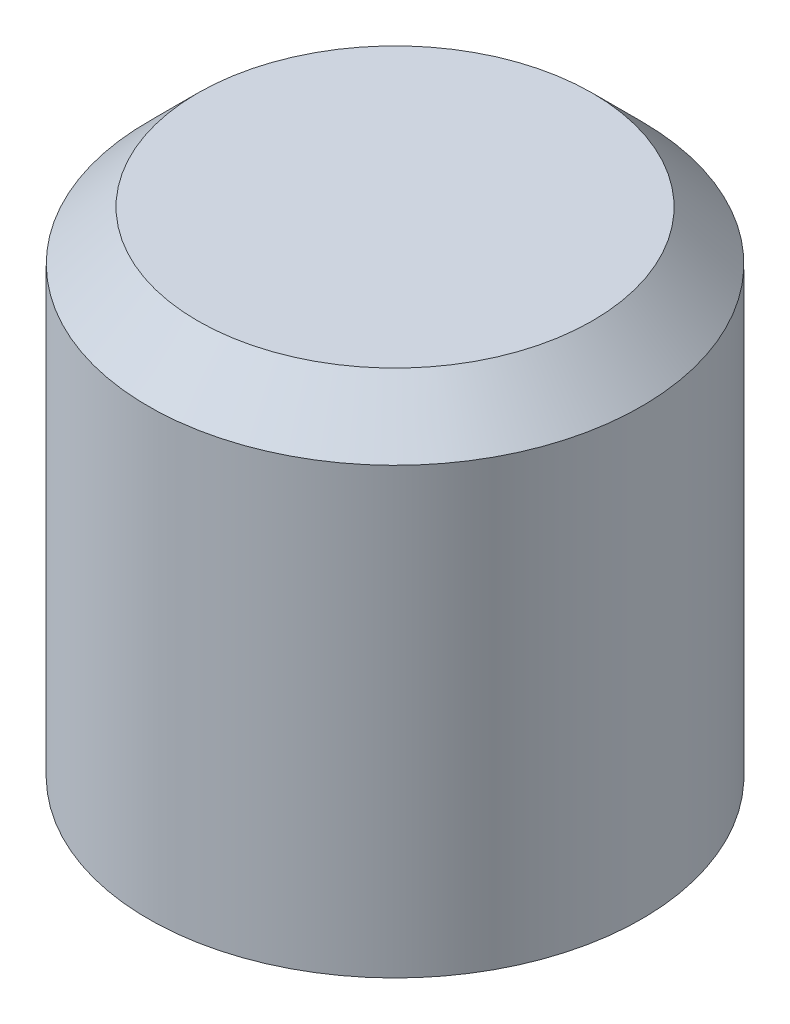
ISO-10303-21;
HEADER;
FILE_DESCRIPTION(('STEP AP214'),'2;1');
FILE_NAME('part.step','',(''),(''),'','','');
FILE_SCHEMA(('AUTOMOTIVE_DESIGN { 1 0 10303 214 1 1 1 1 }'));
ENDSEC;
DATA;
#1=APPLICATION_CONTEXT('core data for automotive mechanical design processes');
#2=APPLICATION_PROTOCOL_DEFINITION('international standard','automotive_design',2000,#1);
#3=PRODUCT_CONTEXT('',#1,'mechanical');
#4=PRODUCT('Part','Part','',(#3));
#5=PRODUCT_RELATED_PRODUCT_CATEGORY('part','',(#4));
#6=PRODUCT_DEFINITION_FORMATION('','',#4);
#7=PRODUCT_DEFINITION_CONTEXT('part definition',#1,'design');
#8=PRODUCT_DEFINITION('design','',#6,#7);
#9=PRODUCT_DEFINITION_SHAPE('','',#8);
#10=(LENGTH_UNIT() NAMED_UNIT(*) SI_UNIT(.MILLI.,.METRE.));
#11=(NAMED_UNIT(*) PLANE_ANGLE_UNIT() SI_UNIT($,.RADIAN.));
#12=(NAMED_UNIT(*) SI_UNIT($,.STERADIAN.) SOLID_ANGLE_UNIT());
#13=UNCERTAINTY_MEASURE_WITH_UNIT(LENGTH_MEASURE(1.E-05),#10,'distance_accuracy_value','');
#14=(GEOMETRIC_REPRESENTATION_CONTEXT(3) GLOBAL_UNCERTAINTY_ASSIGNED_CONTEXT((#13)) GLOBAL_UNIT_ASSIGNED_CONTEXT((#10,
#11,#12)) REPRESENTATION_CONTEXT('',''));
#15=CARTESIAN_POINT('',(0.,0.,0.));
#16=DIRECTION('',(0.,0.,1.));
#17=DIRECTION('',(1.,0.,0.));
#18=AXIS2_PLACEMENT_3D('',#15,#16,#17);
#19=CARTESIAN_POINT('',(0.,0.,0.));
#20=DIRECTION('',(0.,-1.,0.));
#21=DIRECTION('',(0.,0.,-1.));
#22=AXIS2_PLACEMENT_3D('',#19,#20,#21);
#23=PLANE('',#22);
#24=CARTESIAN_POINT('',(0.,0.,0.));
#25=DIRECTION('',(0.,-1.,0.));
#26=DIRECTION('',(0.,0.,-1.));
#27=AXIS2_PLACEMENT_3D('',#24,#25,#26);
#28=CIRCLE('',#27,10.);
#29=CARTESIAN_POINT('',(0.,0.,-10.));
#30=VERTEX_POINT('',#29);
#31=EDGE_CURVE('E10',#30,#30,#28,.T.);
#32=ORIENTED_EDGE('',*,*,#31,.T.);
#33=EDGE_LOOP('',(#32));
#34=FACE_BOUND('',#33,.T.);
#35=ADVANCED_FACE('F40',(#34),#23,.T.);
#36=CARTESIAN_POINT('',(0.,-10.,0.));
#37=DIRECTION('',(0.,-1.,0.));
#38=DIRECTION('',(0.,0.,-1.));
#39=AXIS2_PLACEMENT_3D('',#36,#37,#38);
#40=CYLINDRICAL_SURFACE('',#39,10.);
#41=CARTESIAN_POINT('',(0.,18.,0.));
#42=DIRECTION('',(0.,-1.,0.));
#43=DIRECTION('',(0.,0.,-1.));
#44=AXIS2_PLACEMENT_3D('',#41,#42,#43);
#45=CIRCLE('',#44,10.);
#46=CARTESIAN_POINT('',(0.,18.,-10.));
#47=VERTEX_POINT('',#46);
#48=EDGE_CURVE('E46',#47,#47,#45,.T.);
#49=ORIENTED_EDGE('',*,*,#48,.T.);
#50=EDGE_LOOP('',(#49));
#51=FACE_BOUND('',#50,.T.);
#52=ORIENTED_EDGE('',*,*,#31,.F.);
#53=EDGE_LOOP('',(#52));
#54=FACE_BOUND('',#53,.T.);
#55=ADVANCED_FACE('F66',(#51,#54),#40,.T.);
#56=CARTESIAN_POINT('',(0.,18.,0.));
#57=DIRECTION('',(0.,-1.,0.));
#58=DIRECTION('',(0.,0.,-1.));
#59=AXIS2_PLACEMENT_3D('',#56,#57,#58);
#60=CONICAL_SURFACE('',#59,10.,0.785398163397448);
#61=CARTESIAN_POINT('',(0.,20.,0.));
#62=DIRECTION('',(0.,-1.,0.));
#63=DIRECTION('',(0.,0.,-1.));
#64=AXIS2_PLACEMENT_3D('',#61,#62,#63);
#65=CIRCLE('',#64,8.);
#66=CARTESIAN_POINT('',(0.,20.,-8.));
#67=VERTEX_POINT('',#66);
#68=EDGE_CURVE('E50',#67,#67,#65,.T.);
#69=ORIENTED_EDGE('',*,*,#68,.T.);
#70=EDGE_LOOP('',(#69));
#71=FACE_BOUND('',#70,.T.);
#72=ORIENTED_EDGE('',*,*,#48,.F.);
#73=EDGE_LOOP('',(#72));
#74=FACE_BOUND('',#73,.T.);
#75=ADVANCED_FACE('F57',(#71,#74),#60,.T.);
#76=CARTESIAN_POINT('',(8.,20.,0.));
#77=DIRECTION('',(0.,1.,0.));
#78=DIRECTION('',(0.,0.,1.));
#79=AXIS2_PLACEMENT_3D('',#76,#77,#78);
#80=PLANE('',#79);
#81=ORIENTED_EDGE('',*,*,#68,.F.);
#82=EDGE_LOOP('',(#81));
#83=FACE_BOUND('',#82,.T.);
#84=ADVANCED_FACE('F60',(#83),#80,.T.);
#85=CLOSED_SHELL('',(#35,#55,#75,#84));
#86=MANIFOLD_SOLID_BREP('B2',#85);
#87=ADVANCED_BREP_SHAPE_REPRESENTATION('',(#18,#86),#14);
#88=SHAPE_DEFINITION_REPRESENTATION(#9,#87);
ENDSEC;
END-ISO-10303-21;
